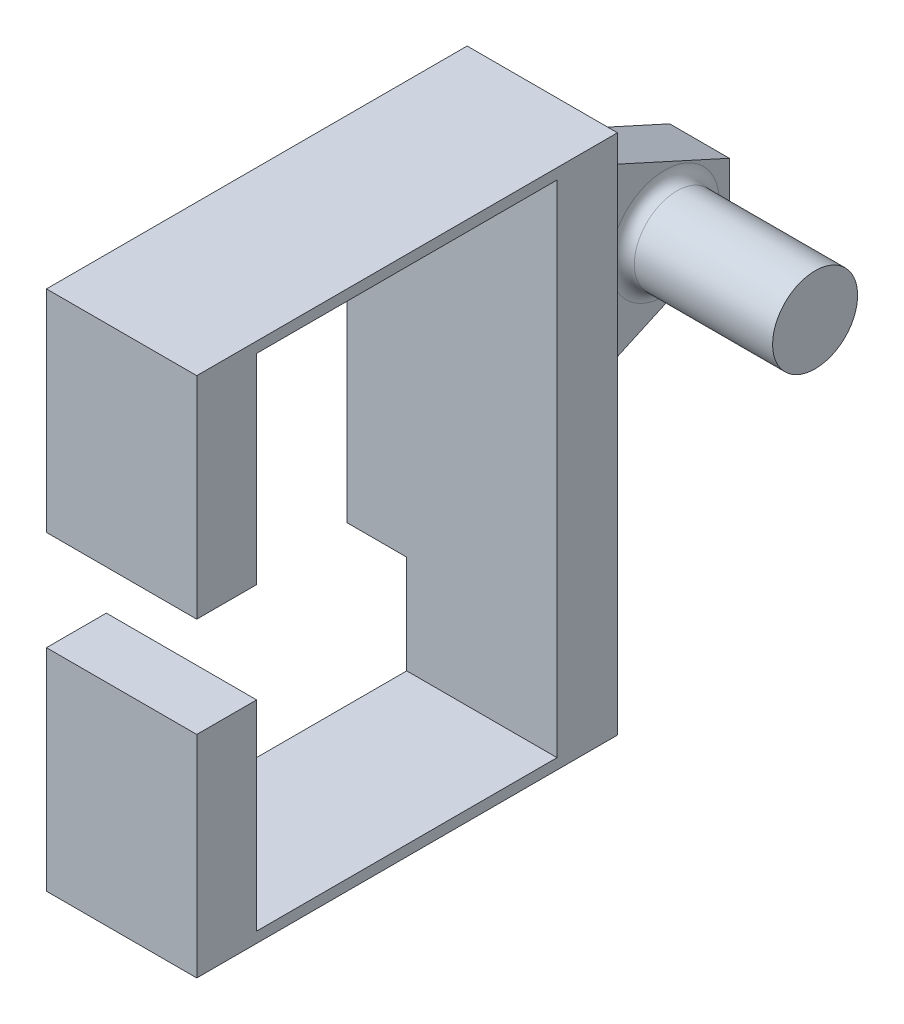
ISO-10303-21;
HEADER;
FILE_DESCRIPTION(('STEP AP214'),'2;1');
FILE_NAME('part.step','',(''),(''),'','','');
FILE_SCHEMA(('AUTOMOTIVE_DESIGN { 1 0 10303 214 1 1 1 1 }'));
ENDSEC;
DATA;
#1=APPLICATION_CONTEXT('core data for automotive mechanical design processes');
#2=APPLICATION_PROTOCOL_DEFINITION('international standard','automotive_design',2000,#1);
#3=PRODUCT_CONTEXT('',#1,'mechanical');
#4=PRODUCT('Part','Part','',(#3));
#5=PRODUCT_RELATED_PRODUCT_CATEGORY('part','',(#4));
#6=PRODUCT_DEFINITION_FORMATION('','',#4);
#7=PRODUCT_DEFINITION_CONTEXT('part definition',#1,'design');
#8=PRODUCT_DEFINITION('design','',#6,#7);
#9=PRODUCT_DEFINITION_SHAPE('','',#8);
#10=(LENGTH_UNIT() NAMED_UNIT(*) SI_UNIT(.MILLI.,.METRE.));
#11=(NAMED_UNIT(*) PLANE_ANGLE_UNIT() SI_UNIT($,.RADIAN.));
#12=(NAMED_UNIT(*) SI_UNIT($,.STERADIAN.) SOLID_ANGLE_UNIT());
#13=UNCERTAINTY_MEASURE_WITH_UNIT(LENGTH_MEASURE(1.E-05),#10,'distance_accuracy_value','');
#14=(GEOMETRIC_REPRESENTATION_CONTEXT(3) GLOBAL_UNCERTAINTY_ASSIGNED_CONTEXT((#13)) GLOBAL_UNIT_ASSIGNED_CONTEXT((#10,
#11,#12)) REPRESENTATION_CONTEXT('',''));
#15=CARTESIAN_POINT('',(0.,0.,0.));
#16=DIRECTION('',(0.,0.,1.));
#17=DIRECTION('',(1.,0.,0.));
#18=AXIS2_PLACEMENT_3D('',#15,#16,#17);
#19=CARTESIAN_POINT('',(-7.56143527171308,0.,0.));
#20=DIRECTION('',(-1.,0.,0.));
#21=DIRECTION('',(0.,0.,1.));
#22=AXIS2_PLACEMENT_3D('',#19,#20,#21);
#23=PLANE('',#22);
#24=DIRECTION('',(0.,-0.413743108028006,-0.910393673395925));
#25=VECTOR('',#24,1.);
#26=CARTESIAN_POINT('',(-7.56143527171308,38.4477314940831,-30.4424892876485));
#27=LINE('',#26,#25);
#28=CARTESIAN_POINT('',(-7.56143527171308,52.2828124069349,0.));
#29=VERTEX_POINT('',#28);
#30=CARTESIAN_POINT('',(-7.56143527171308,37.1779530700765,-33.2364892876485));
#31=VERTEX_POINT('',#30);
#32=EDGE_CURVE('E182',#29,#31,#27,.T.);
#33=ORIENTED_EDGE('',*,*,#32,.T.);
#34=DIRECTION('',(0.,-1.,0.));
#35=VECTOR('',#34,1.);
#36=CARTESIAN_POINT('',(-7.56143527171308,28.9399402497102,-33.2364892876485));
#37=LINE('',#36,#35);
#38=CARTESIAN_POINT('',(-7.56143527171308,28.9399402497102,-33.2364892876485));
#39=VERTEX_POINT('',#38);
#40=EDGE_CURVE('E58',#31,#39,#37,.T.);
#41=ORIENTED_EDGE('',*,*,#40,.T.);
#42=DIRECTION('',(0.,-0.413743108028007,0.910393673395925));
#43=VECTOR('',#42,1.);
#44=CARTESIAN_POINT('',(-7.56143527171308,27.6701618257036,-30.4424892876485));
#45=LINE('',#44,#43);
#46=CARTESIAN_POINT('',(-7.56143527171308,13.8350809128518,0.));
#47=VERTEX_POINT('',#46);
#48=EDGE_CURVE('E179',#39,#47,#45,.T.);
#49=ORIENTED_EDGE('',*,*,#48,.T.);
#50=DIRECTION('',(0.,0.,1.));
#51=VECTOR('',#50,1.);
#52=CARTESIAN_POINT('',(-7.56143527171308,13.8350809128518,0.));
#53=LINE('',#52,#51);
#54=CARTESIAN_POINT('',(-7.56143527171308,13.8350809128518,7.65751071235147));
#55=VERTEX_POINT('',#54);
#56=EDGE_CURVE('E188',#47,#55,#53,.T.);
#57=ORIENTED_EDGE('',*,*,#56,.T.);
#58=DIRECTION('',(0.,1.,0.));
#59=VECTOR('',#58,1.);
#60=CARTESIAN_POINT('',(-7.56143527171308,38.4477314940831,7.65751071235147));
#61=LINE('',#60,#59);
#62=CARTESIAN_POINT('',(-7.56143527171308,52.2828124069349,7.65751071235148));
#63=VERTEX_POINT('',#62);
#64=EDGE_CURVE('E200',#55,#63,#61,.T.);
#65=ORIENTED_EDGE('',*,*,#64,.T.);
#66=DIRECTION('',(0.,0.,-1.));
#67=VECTOR('',#66,1.);
#68=CARTESIAN_POINT('',(-7.56143527171308,52.2828124069349,0.));
#69=LINE('',#68,#67);
#70=EDGE_CURVE('E186',#63,#29,#69,.T.);
#71=ORIENTED_EDGE('',*,*,#70,.T.);
#72=EDGE_LOOP('',(#33,#41,#49,#57,#65,#71));
#73=FACE_BOUND('',#72,.T.);
#74=ADVANCED_FACE('F44',(#73),#23,.T.);
#75=CARTESIAN_POINT('',(0.,0.,0.));
#76=DIRECTION('',(-1.,0.,0.));
#77=DIRECTION('',(0.,0.,1.));
#78=AXIS2_PLACEMENT_3D('',#75,#76,#77);
#79=PLANE('',#78);
#80=CARTESIAN_POINT('',(0.,33.0589466598933,-25.0537044534588));
#81=DIRECTION('',(-1.,0.,0.));
#82=DIRECTION('',(0.,0.,1.));
#83=AXIS2_PLACEMENT_3D('',#80,#81,#82);
#84=CIRCLE('',#83,6.91278483418973);
#85=CARTESIAN_POINT('',(0.,33.0589466598933,-18.1409196192691));
#86=VERTEX_POINT('',#85);
#87=EDGE_CURVE('E11',#86,#86,#84,.T.);
#88=ORIENTED_EDGE('',*,*,#87,.T.);
#89=EDGE_LOOP('',(#88));
#90=FACE_BOUND('',#89,.T.);
#91=DIRECTION('',(0.,-1.,0.));
#92=VECTOR('',#91,1.);
#93=CARTESIAN_POINT('',(0.,28.9399402497102,-33.2364892876485));
#94=LINE('',#93,#92);
#95=CARTESIAN_POINT('',(0.,37.1779530700765,-33.2364892876485));
#96=VERTEX_POINT('',#95);
#97=CARTESIAN_POINT('',(0.,28.9399402497102,-33.2364892876485));
#98=VERTEX_POINT('',#97);
#99=EDGE_CURVE('E175',#96,#98,#94,.T.);
#100=ORIENTED_EDGE('',*,*,#99,.F.);
#101=DIRECTION('',(0.,-0.413743108028006,-0.910393673395925));
#102=VECTOR('',#101,1.);
#103=CARTESIAN_POINT('',(0.,38.4477314940831,-30.4424892876485));
#104=LINE('',#103,#102);
#105=CARTESIAN_POINT('',(0.,52.2828124069349,0.));
#106=VERTEX_POINT('',#105);
#107=EDGE_CURVE('E203',#106,#96,#104,.T.);
#108=ORIENTED_EDGE('',*,*,#107,.F.);
#109=DIRECTION('',(0.,1.,0.));
#110=VECTOR('',#109,1.);
#111=CARTESIAN_POINT('',(0.,0.,0.));
#112=LINE('',#111,#110);
#113=CARTESIAN_POINT('',(0.,13.8350809128518,0.));
#114=VERTEX_POINT('',#113);
#115=EDGE_CURVE('E232',#114,#106,#112,.T.);
#116=ORIENTED_EDGE('',*,*,#115,.F.);
#117=DIRECTION('',(0.,-0.413743108028006,0.910393673395925));
#118=VECTOR('',#117,1.);
#119=CARTESIAN_POINT('',(0.,27.6701618257036,-30.4424892876485));
#120=LINE('',#119,#118);
#121=EDGE_CURVE('E69',#98,#114,#120,.T.);
#122=ORIENTED_EDGE('',*,*,#121,.F.);
#123=EDGE_LOOP('',(#100,#108,#116,#122));
#124=FACE_BOUND('',#123,.T.);
#125=ADVANCED_FACE('F315',(#90,#124),#79,.F.);
#126=CARTESIAN_POINT('',(40.5341764917601,27.6701618257036,-30.4424892876485));
#127=DIRECTION('',(0.,-0.910393673395925,-0.413743108028006));
#128=DIRECTION('',(0.,0.413743108028006,-0.910393673395925));
#129=AXIS2_PLACEMENT_3D('',#126,#127,#128);
#130=PLANE('',#129);
#131=ORIENTED_EDGE('',*,*,#48,.F.);
#132=DIRECTION('',(1.,0.,0.));
#133=VECTOR('',#132,1.);
#134=CARTESIAN_POINT('',(-7.56143527171308,28.9399402497102,-33.2364892876485));
#135=LINE('',#134,#133);
#136=EDGE_CURVE('E169',#39,#98,#135,.T.);
#137=ORIENTED_EDGE('',*,*,#136,.T.);
#138=ORIENTED_EDGE('',*,*,#121,.T.);
#139=DIRECTION('',(-1.,0.,0.));
#140=VECTOR('',#139,1.);
#141=CARTESIAN_POINT('',(40.5341764917601,13.8350809128518,0.));
#142=LINE('',#141,#140);
#143=EDGE_CURVE('E190',#114,#47,#142,.T.);
#144=ORIENTED_EDGE('',*,*,#143,.T.);
#145=EDGE_LOOP('',(#131,#137,#138,#144));
#146=FACE_BOUND('',#145,.T.);
#147=ADVANCED_FACE('F184',(#146),#130,.T.);
#148=CARTESIAN_POINT('',(0.,0.,0.));
#149=DIRECTION('',(1.,0.,0.));
#150=DIRECTION('',(0.,0.,-1.));
#151=AXIS2_PLACEMENT_3D('',#148,#149,#150);
#152=PLANE('',#151);
#153=DIRECTION('',(0.,0.,-1.));
#154=VECTOR('',#153,1.);
#155=CARTESIAN_POINT('',(0.,52.2828124069349,0.));
#156=LINE('',#155,#154);
#157=CARTESIAN_POINT('',(0.,52.2828124069349,7.65751071235147));
#158=VERTEX_POINT('',#157);
#159=EDGE_CURVE('E404',#158,#106,#156,.T.);
#160=ORIENTED_EDGE('',*,*,#159,.F.);
#161=DIRECTION('',(0.,-1.,0.));
#162=VECTOR('',#161,1.);
#163=CARTESIAN_POINT('',(0.,1.35466665989335,7.65751071235147));
#164=LINE('',#163,#162);
#165=CARTESIAN_POINT('',(0.,64.7632266598933,7.65751071235147));
#166=VERTEX_POINT('',#165);
#167=EDGE_CURVE('E246',#166,#158,#164,.T.);
#168=ORIENTED_EDGE('',*,*,#167,.F.);
#169=DIRECTION('',(0.,0.,-1.));
#170=VECTOR('',#169,1.);
#171=CARTESIAN_POINT('',(0.,64.7632266598933,45.7321107123515));
#172=LINE('',#171,#170);
#173=CARTESIAN_POINT('',(0.,64.7632266598933,45.7321107123515));
#174=VERTEX_POINT('',#173);
#175=EDGE_CURVE('E243',#174,#166,#172,.T.);
#176=ORIENTED_EDGE('',*,*,#175,.F.);
#177=DIRECTION('',(0.,1.,0.));
#178=VECTOR('',#177,1.);
#179=CARTESIAN_POINT('',(0.,39.3835466598933,45.7321107123515));
#180=LINE('',#179,#178);
#181=CARTESIAN_POINT('',(0.,39.3835466598933,45.7321107123515));
#182=VERTEX_POINT('',#181);
#183=EDGE_CURVE('E241',#182,#174,#180,.T.);
#184=ORIENTED_EDGE('',*,*,#183,.F.);
#185=DIRECTION('',(0.,0.,-1.));
#186=VECTOR('',#185,1.);
#187=CARTESIAN_POINT('',(0.,39.3835466598933,53.3205661447543));
#188=LINE('',#187,#186);
#189=CARTESIAN_POINT('',(0.,39.3835466598933,53.3205661447543));
#190=VERTEX_POINT('',#189);
#191=EDGE_CURVE('E237',#190,#182,#188,.T.);
#192=ORIENTED_EDGE('',*,*,#191,.F.);
#193=DIRECTION('',(0.,-1.,0.));
#194=VECTOR('',#193,1.);
#195=CARTESIAN_POINT('',(0.,66.1178933197867,53.3205661447543));
#196=LINE('',#195,#194);
#197=CARTESIAN_POINT('',(0.,66.1178933197867,53.3205661447543));
#198=VERTEX_POINT('',#197);
#199=EDGE_CURVE('E240',#198,#190,#196,.T.);
#200=ORIENTED_EDGE('',*,*,#199,.F.);
#201=DIRECTION('',(0.,0.,1.));
#202=VECTOR('',#201,1.);
#203=CARTESIAN_POINT('',(0.,66.1178933197867,0.));
#204=LINE('',#203,#202);
#205=CARTESIAN_POINT('',(0.,66.1178933197867,0.));
#206=VERTEX_POINT('',#205);
#207=EDGE_CURVE('E234',#206,#198,#204,.T.);
#208=ORIENTED_EDGE('',*,*,#207,.F.);
#209=EDGE_CURVE('E202',#106,#206,#112,.T.);
#210=ORIENTED_EDGE('',*,*,#209,.F.);
#211=EDGE_LOOP('',(#160,#168,#176,#184,#192,#200,#208,#210));
#212=FACE_BOUND('',#211,.T.);
#213=ADVANCED_FACE('F327',(#212),#152,.F.);
#214=DIRECTION('',(0.,0.,1.));
#215=VECTOR('',#214,1.);
#216=CARTESIAN_POINT('',(0.,13.8350809128518,0.));
#217=LINE('',#216,#215);
#218=CARTESIAN_POINT('',(0.,13.8350809128518,7.65751071235147));
#219=VERTEX_POINT('',#218);
#220=EDGE_CURVE('E391',#114,#219,#217,.T.);
#221=ORIENTED_EDGE('',*,*,#220,.F.);
#222=CARTESIAN_POINT('',(0.,0.,0.));
#223=VERTEX_POINT('',#222);
#224=EDGE_CURVE('E233',#223,#114,#112,.T.);
#225=ORIENTED_EDGE('',*,*,#224,.F.);
#226=DIRECTION('',(0.,0.,-1.));
#227=VECTOR('',#226,1.);
#228=CARTESIAN_POINT('',(0.,0.,0.));
#229=LINE('',#228,#227);
#230=CARTESIAN_POINT('',(0.,0.,53.3205661447543));
#231=VERTEX_POINT('',#230);
#232=EDGE_CURVE('E206',#231,#223,#229,.T.);
#233=ORIENTED_EDGE('',*,*,#232,.F.);
#234=DIRECTION('',(0.,-1.,0.));
#235=VECTOR('',#234,1.);
#236=CARTESIAN_POINT('',(0.,0.,53.3205661447543));
#237=LINE('',#236,#235);
#238=CARTESIAN_POINT('',(0.,26.7343466598933,53.3205661447543));
#239=VERTEX_POINT('',#238);
#240=EDGE_CURVE('E253',#239,#231,#237,.T.);
#241=ORIENTED_EDGE('',*,*,#240,.F.);
#242=DIRECTION('',(0.,0.,1.));
#243=VECTOR('',#242,1.);
#244=CARTESIAN_POINT('',(0.,26.7343466598933,53.3205661447543));
#245=LINE('',#244,#243);
#246=CARTESIAN_POINT('',(0.,26.7343466598933,45.7321107123515));
#247=VERTEX_POINT('',#246);
#248=EDGE_CURVE('E254',#247,#239,#245,.T.);
#249=ORIENTED_EDGE('',*,*,#248,.F.);
#250=DIRECTION('',(0.,1.,0.));
#251=VECTOR('',#250,1.);
#252=CARTESIAN_POINT('',(0.,26.7343466598933,45.7321107123515));
#253=LINE('',#252,#251);
#254=CARTESIAN_POINT('',(0.,1.35466665989334,45.7321107123515));
#255=VERTEX_POINT('',#254);
#256=EDGE_CURVE('E252',#255,#247,#253,.T.);
#257=ORIENTED_EDGE('',*,*,#256,.F.);
#258=DIRECTION('',(0.,0.,1.));
#259=VECTOR('',#258,1.);
#260=CARTESIAN_POINT('',(0.,1.35466665989334,45.7321107123515));
#261=LINE('',#260,#259);
#262=CARTESIAN_POINT('',(0.,1.35466665989335,7.65751071235147));
#263=VERTEX_POINT('',#262);
#264=EDGE_CURVE('E248',#263,#255,#261,.T.);
#265=ORIENTED_EDGE('',*,*,#264,.F.);
#266=EDGE_CURVE('E244',#219,#263,#164,.T.);
#267=ORIENTED_EDGE('',*,*,#266,.F.);
#268=EDGE_LOOP('',(#221,#225,#233,#241,#249,#257,#265,#267));
#269=FACE_BOUND('',#268,.T.);
#270=ADVANCED_FACE('F330',(#269),#152,.F.);
#271=CARTESIAN_POINT('',(19.05,0.,0.));
#272=DIRECTION('',(0.,0.,1.));
#273=DIRECTION('',(1.,0.,0.));
#274=AXIS2_PLACEMENT_3D('',#271,#272,#273);
#275=PLANE('',#274);
#276=ORIENTED_EDGE('',*,*,#224,.T.);
#277=ORIENTED_EDGE('',*,*,#115,.T.);
#278=ORIENTED_EDGE('',*,*,#209,.T.);
#279=DIRECTION('',(-1.,0.,0.));
#280=VECTOR('',#279,1.);
#281=CARTESIAN_POINT('',(19.05,66.1178933197867,0.));
#282=LINE('',#281,#280);
#283=CARTESIAN_POINT('',(19.05,66.1178933197867,0.));
#284=VERTEX_POINT('',#283);
#285=EDGE_CURVE('E286',#284,#206,#282,.T.);
#286=ORIENTED_EDGE('',*,*,#285,.F.);
#287=DIRECTION('',(0.,1.,0.));
#288=VECTOR('',#287,1.);
#289=CARTESIAN_POINT('',(19.05,0.,0.));
#290=LINE('',#289,#288);
#291=CARTESIAN_POINT('',(19.05,0.,0.));
#292=VERTEX_POINT('',#291);
#293=EDGE_CURVE('E205',#292,#284,#290,.T.);
#294=ORIENTED_EDGE('',*,*,#293,.F.);
#295=DIRECTION('',(-1.,0.,0.));
#296=VECTOR('',#295,1.);
#297=CARTESIAN_POINT('',(19.05,0.,0.));
#298=LINE('',#297,#296);
#299=EDGE_CURVE('E229',#292,#223,#298,.T.);
#300=ORIENTED_EDGE('',*,*,#299,.T.);
#301=EDGE_LOOP('',(#276,#277,#278,#286,#294,#300));
#302=FACE_BOUND('',#301,.T.);
#303=ADVANCED_FACE('F373',(#302),#275,.F.);
#304=CARTESIAN_POINT('',(19.05,66.1178933197867,0.));
#305=DIRECTION('',(0.,-1.,0.));
#306=DIRECTION('',(0.,0.,-1.));
#307=AXIS2_PLACEMENT_3D('',#304,#305,#306);
#308=PLANE('',#307);
#309=ORIENTED_EDGE('',*,*,#207,.T.);
#310=DIRECTION('',(-1.,0.,0.));
#311=VECTOR('',#310,1.);
#312=CARTESIAN_POINT('',(19.05,66.1178933197867,53.3205661447543));
#313=LINE('',#312,#311);
#314=CARTESIAN_POINT('',(19.05,66.1178933197867,53.3205661447543));
#315=VERTEX_POINT('',#314);
#316=EDGE_CURVE('E289',#315,#198,#313,.T.);
#317=ORIENTED_EDGE('',*,*,#316,.F.);
#318=DIRECTION('',(0.,0.,1.));
#319=VECTOR('',#318,1.);
#320=CARTESIAN_POINT('',(19.05,66.1178933197867,0.));
#321=LINE('',#320,#319);
#322=EDGE_CURVE('E210',#284,#315,#321,.T.);
#323=ORIENTED_EDGE('',*,*,#322,.F.);
#324=ORIENTED_EDGE('',*,*,#285,.T.);
#325=EDGE_LOOP('',(#309,#317,#323,#324));
#326=FACE_BOUND('',#325,.T.);
#327=ADVANCED_FACE('F369',(#326),#308,.F.);
#328=CARTESIAN_POINT('',(19.05,66.1178933197867,53.3205661447543));
#329=DIRECTION('',(0.,0.,-1.));
#330=DIRECTION('',(-1.,0.,0.));
#331=AXIS2_PLACEMENT_3D('',#328,#329,#330);
#332=PLANE('',#331);
#333=ORIENTED_EDGE('',*,*,#199,.T.);
#334=DIRECTION('',(-1.,0.,0.));
#335=VECTOR('',#334,1.);
#336=CARTESIAN_POINT('',(19.05,39.3835466598933,53.3205661447543));
#337=LINE('',#336,#335);
#338=CARTESIAN_POINT('',(19.05,39.3835466598933,53.3205661447543));
#339=VERTEX_POINT('',#338);
#340=EDGE_CURVE('E283',#339,#190,#337,.T.);
#341=ORIENTED_EDGE('',*,*,#340,.F.);
#342=DIRECTION('',(0.,-1.,0.));
#343=VECTOR('',#342,1.);
#344=CARTESIAN_POINT('',(19.05,66.1178933197867,53.3205661447543));
#345=LINE('',#344,#343);
#346=EDGE_CURVE('E208',#315,#339,#345,.T.);
#347=ORIENTED_EDGE('',*,*,#346,.F.);
#348=ORIENTED_EDGE('',*,*,#316,.T.);
#349=EDGE_LOOP('',(#333,#341,#347,#348));
#350=FACE_BOUND('',#349,.T.);
#351=ADVANCED_FACE('F366',(#350),#332,.F.);
#352=CARTESIAN_POINT('',(19.05,39.3835466598933,53.3205661447543));
#353=DIRECTION('',(0.,1.,0.));
#354=DIRECTION('',(0.,0.,1.));
#355=AXIS2_PLACEMENT_3D('',#352,#353,#354);
#356=PLANE('',#355);
#357=ORIENTED_EDGE('',*,*,#191,.T.);
#358=DIRECTION('',(-1.,0.,0.));
#359=VECTOR('',#358,1.);
#360=CARTESIAN_POINT('',(19.05,39.3835466598933,45.7321107123515));
#361=LINE('',#360,#359);
#362=CARTESIAN_POINT('',(19.05,39.3835466598933,45.7321107123515));
#363=VERTEX_POINT('',#362);
#364=EDGE_CURVE('E281',#363,#182,#361,.T.);
#365=ORIENTED_EDGE('',*,*,#364,.F.);
#366=DIRECTION('',(0.,0.,-1.));
#367=VECTOR('',#366,1.);
#368=CARTESIAN_POINT('',(19.05,39.3835466598933,53.3205661447543));
#369=LINE('',#368,#367);
#370=EDGE_CURVE('E215',#339,#363,#369,.T.);
#371=ORIENTED_EDGE('',*,*,#370,.F.);
#372=ORIENTED_EDGE('',*,*,#340,.T.);
#373=EDGE_LOOP('',(#357,#365,#371,#372));
#374=FACE_BOUND('',#373,.T.);
#375=ADVANCED_FACE('F365',(#374),#356,.F.);
#376=CARTESIAN_POINT('',(19.05,39.3835466598933,45.7321107123515));
#377=DIRECTION('',(0.,0.,1.));
#378=DIRECTION('',(1.,0.,0.));
#379=AXIS2_PLACEMENT_3D('',#376,#377,#378);
#380=PLANE('',#379);
#381=ORIENTED_EDGE('',*,*,#183,.T.);
#382=DIRECTION('',(-1.,0.,0.));
#383=VECTOR('',#382,1.);
#384=CARTESIAN_POINT('',(19.05,64.7632266598933,45.7321107123515));
#385=LINE('',#384,#383);
#386=CARTESIAN_POINT('',(19.05,64.7632266598933,45.7321107123515));
#387=VERTEX_POINT('',#386);
#388=EDGE_CURVE('E279',#387,#174,#385,.T.);
#389=ORIENTED_EDGE('',*,*,#388,.F.);
#390=DIRECTION('',(0.,1.,0.));
#391=VECTOR('',#390,1.);
#392=CARTESIAN_POINT('',(19.05,39.3835466598933,45.7321107123515));
#393=LINE('',#392,#391);
#394=EDGE_CURVE('E211',#363,#387,#393,.T.);
#395=ORIENTED_EDGE('',*,*,#394,.F.);
#396=ORIENTED_EDGE('',*,*,#364,.T.);
#397=EDGE_LOOP('',(#381,#389,#395,#396));
#398=FACE_BOUND('',#397,.T.);
#399=ADVANCED_FACE('F356',(#398),#380,.F.);
#400=CARTESIAN_POINT('',(19.05,64.7632266598933,45.7321107123515));
#401=DIRECTION('',(0.,1.,0.));
#402=DIRECTION('',(0.,0.,1.));
#403=AXIS2_PLACEMENT_3D('',#400,#401,#402);
#404=PLANE('',#403);
#405=ORIENTED_EDGE('',*,*,#175,.T.);
#406=DIRECTION('',(-1.,0.,0.));
#407=VECTOR('',#406,1.);
#408=CARTESIAN_POINT('',(19.05,64.7632266598933,7.65751071235147));
#409=LINE('',#408,#407);
#410=CARTESIAN_POINT('',(19.05,64.7632266598933,7.65751071235147));
#411=VERTEX_POINT('',#410);
#412=EDGE_CURVE('E273',#411,#166,#409,.T.);
#413=ORIENTED_EDGE('',*,*,#412,.F.);
#414=DIRECTION('',(0.,0.,-1.));
#415=VECTOR('',#414,1.);
#416=CARTESIAN_POINT('',(19.05,64.7632266598933,45.7321107123515));
#417=LINE('',#416,#415);
#418=EDGE_CURVE('E216',#387,#411,#417,.T.);
#419=ORIENTED_EDGE('',*,*,#418,.F.);
#420=ORIENTED_EDGE('',*,*,#388,.T.);
#421=EDGE_LOOP('',(#405,#413,#419,#420));
#422=FACE_BOUND('',#421,.T.);
#423=ADVANCED_FACE('F355',(#422),#404,.F.);
#424=CARTESIAN_POINT('',(19.05,1.35466665989335,7.65751071235147));
#425=DIRECTION('',(0.,0.,-1.));
#426=DIRECTION('',(-1.,0.,0.));
#427=AXIS2_PLACEMENT_3D('',#424,#425,#426);
#428=PLANE('',#427);
#429=ORIENTED_EDGE('',*,*,#167,.T.);
#430=DIRECTION('',(-1.,0.,0.));
#431=VECTOR('',#430,1.);
#432=CARTESIAN_POINT('',(40.5341764917601,52.2828124069349,7.65751071235148));
#433=LINE('',#432,#431);
#434=EDGE_CURVE('E395',#158,#63,#433,.T.);
#435=ORIENTED_EDGE('',*,*,#434,.T.);
#436=ORIENTED_EDGE('',*,*,#64,.F.);
#437=DIRECTION('',(-1.,0.,0.));
#438=VECTOR('',#437,1.);
#439=CARTESIAN_POINT('',(40.5341764917601,13.8350809128518,7.65751071235147));
#440=LINE('',#439,#438);
#441=EDGE_CURVE('E172',#219,#55,#440,.T.);
#442=ORIENTED_EDGE('',*,*,#441,.F.);
#443=ORIENTED_EDGE('',*,*,#266,.T.);
#444=DIRECTION('',(-1.,0.,0.));
#445=VECTOR('',#444,1.);
#446=CARTESIAN_POINT('',(19.05,1.35466665989335,7.65751071235147));
#447=LINE('',#446,#445);
#448=CARTESIAN_POINT('',(19.05,1.35466665989335,7.65751071235147));
#449=VERTEX_POINT('',#448);
#450=EDGE_CURVE('E275',#449,#263,#447,.T.);
#451=ORIENTED_EDGE('',*,*,#450,.F.);
#452=DIRECTION('',(0.,-1.,0.));
#453=VECTOR('',#452,1.);
#454=CARTESIAN_POINT('',(19.05,1.35466665989335,7.65751071235147));
#455=LINE('',#454,#453);
#456=EDGE_CURVE('E219',#411,#449,#455,.T.);
#457=ORIENTED_EDGE('',*,*,#456,.F.);
#458=ORIENTED_EDGE('',*,*,#412,.T.);
#459=EDGE_LOOP('',(#429,#435,#436,#442,#443,#451,#457,#458));
#460=FACE_BOUND('',#459,.T.);
#461=ADVANCED_FACE('F350',(#460),#428,.F.);
#462=CARTESIAN_POINT('',(19.05,1.35466665989334,45.7321107123515));
#463=DIRECTION('',(0.,-1.,0.));
#464=DIRECTION('',(0.,0.,-1.));
#465=AXIS2_PLACEMENT_3D('',#462,#463,#464);
#466=PLANE('',#465);
#467=ORIENTED_EDGE('',*,*,#264,.T.);
#468=DIRECTION('',(-1.,0.,0.));
#469=VECTOR('',#468,1.);
#470=CARTESIAN_POINT('',(19.05,1.35466665989334,45.7321107123515));
#471=LINE('',#470,#469);
#472=CARTESIAN_POINT('',(19.05,1.35466665989334,45.7321107123515));
#473=VERTEX_POINT('',#472);
#474=EDGE_CURVE('E270',#473,#255,#471,.T.);
#475=ORIENTED_EDGE('',*,*,#474,.F.);
#476=DIRECTION('',(0.,0.,1.));
#477=VECTOR('',#476,1.);
#478=CARTESIAN_POINT('',(19.05,1.35466665989334,45.7321107123515));
#479=LINE('',#478,#477);
#480=EDGE_CURVE('E220',#449,#473,#479,.T.);
#481=ORIENTED_EDGE('',*,*,#480,.F.);
#482=ORIENTED_EDGE('',*,*,#450,.T.);
#483=EDGE_LOOP('',(#467,#475,#481,#482));
#484=FACE_BOUND('',#483,.T.);
#485=ADVANCED_FACE('F346',(#484),#466,.F.);
#486=CARTESIAN_POINT('',(19.05,26.7343466598933,45.7321107123515));
#487=DIRECTION('',(0.,0.,1.));
#488=DIRECTION('',(1.,0.,0.));
#489=AXIS2_PLACEMENT_3D('',#486,#487,#488);
#490=PLANE('',#489);
#491=ORIENTED_EDGE('',*,*,#256,.T.);
#492=DIRECTION('',(-1.,0.,0.));
#493=VECTOR('',#492,1.);
#494=CARTESIAN_POINT('',(19.05,26.7343466598933,45.7321107123515));
#495=LINE('',#494,#493);
#496=CARTESIAN_POINT('',(19.05,26.7343466598933,45.7321107123515));
#497=VERTEX_POINT('',#496);
#498=EDGE_CURVE('E268',#497,#247,#495,.T.);
#499=ORIENTED_EDGE('',*,*,#498,.F.);
#500=DIRECTION('',(0.,1.,0.));
#501=VECTOR('',#500,1.);
#502=CARTESIAN_POINT('',(19.05,26.7343466598933,45.7321107123515));
#503=LINE('',#502,#501);
#504=EDGE_CURVE('E224',#473,#497,#503,.T.);
#505=ORIENTED_EDGE('',*,*,#504,.F.);
#506=ORIENTED_EDGE('',*,*,#474,.T.);
#507=EDGE_LOOP('',(#491,#499,#505,#506));
#508=FACE_BOUND('',#507,.T.);
#509=ADVANCED_FACE('F345',(#508),#490,.F.);
#510=CARTESIAN_POINT('',(19.05,26.7343466598933,53.3205661447543));
#511=DIRECTION('',(0.,-1.,0.));
#512=DIRECTION('',(0.,0.,-1.));
#513=AXIS2_PLACEMENT_3D('',#510,#511,#512);
#514=PLANE('',#513);
#515=ORIENTED_EDGE('',*,*,#248,.T.);
#516=DIRECTION('',(-1.,0.,0.));
#517=VECTOR('',#516,1.);
#518=CARTESIAN_POINT('',(19.05,26.7343466598933,53.3205661447543));
#519=LINE('',#518,#517);
#520=CARTESIAN_POINT('',(19.05,26.7343466598933,53.3205661447543));
#521=VERTEX_POINT('',#520);
#522=EDGE_CURVE('E264',#521,#239,#519,.T.);
#523=ORIENTED_EDGE('',*,*,#522,.F.);
#524=DIRECTION('',(0.,0.,1.));
#525=VECTOR('',#524,1.);
#526=CARTESIAN_POINT('',(19.05,26.7343466598933,53.3205661447543));
#527=LINE('',#526,#525);
#528=EDGE_CURVE('E225',#497,#521,#527,.T.);
#529=ORIENTED_EDGE('',*,*,#528,.F.);
#530=ORIENTED_EDGE('',*,*,#498,.T.);
#531=EDGE_LOOP('',(#515,#523,#529,#530));
#532=FACE_BOUND('',#531,.T.);
#533=ADVANCED_FACE('F336',(#532),#514,.F.);
#534=CARTESIAN_POINT('',(19.05,0.,53.3205661447543));
#535=DIRECTION('',(0.,0.,-1.));
#536=DIRECTION('',(-1.,0.,0.));
#537=AXIS2_PLACEMENT_3D('',#534,#535,#536);
#538=PLANE('',#537);
#539=ORIENTED_EDGE('',*,*,#240,.T.);
#540=DIRECTION('',(-1.,0.,0.));
#541=VECTOR('',#540,1.);
#542=CARTESIAN_POINT('',(19.05,0.,53.3205661447543));
#543=LINE('',#542,#541);
#544=CARTESIAN_POINT('',(19.05,0.,53.3205661447543));
#545=VERTEX_POINT('',#544);
#546=EDGE_CURVE('E258',#545,#231,#543,.T.);
#547=ORIENTED_EDGE('',*,*,#546,.F.);
#548=DIRECTION('',(0.,-1.,0.));
#549=VECTOR('',#548,1.);
#550=CARTESIAN_POINT('',(19.05,0.,53.3205661447543));
#551=LINE('',#550,#549);
#552=EDGE_CURVE('E228',#521,#545,#551,.T.);
#553=ORIENTED_EDGE('',*,*,#552,.F.);
#554=ORIENTED_EDGE('',*,*,#522,.T.);
#555=EDGE_LOOP('',(#539,#547,#553,#554));
#556=FACE_BOUND('',#555,.T.);
#557=ADVANCED_FACE('F335',(#556),#538,.F.);
#558=CARTESIAN_POINT('',(19.05,0.,0.));
#559=DIRECTION('',(0.,1.,0.));
#560=DIRECTION('',(0.,0.,1.));
#561=AXIS2_PLACEMENT_3D('',#558,#559,#560);
#562=PLANE('',#561);
#563=ORIENTED_EDGE('',*,*,#232,.T.);
#564=ORIENTED_EDGE('',*,*,#299,.F.);
#565=DIRECTION('',(0.,0.,-1.));
#566=VECTOR('',#565,1.);
#567=CARTESIAN_POINT('',(19.05,0.,0.));
#568=LINE('',#567,#566);
#569=EDGE_CURVE('E226',#545,#292,#568,.T.);
#570=ORIENTED_EDGE('',*,*,#569,.F.);
#571=ORIENTED_EDGE('',*,*,#546,.T.);
#572=EDGE_LOOP('',(#563,#564,#570,#571));
#573=FACE_BOUND('',#572,.T.);
#574=ADVANCED_FACE('F323',(#573),#562,.F.);
#575=CARTESIAN_POINT('',(19.05,0.,0.));
#576=DIRECTION('',(1.,0.,0.));
#577=DIRECTION('',(0.,0.,-1.));
#578=AXIS2_PLACEMENT_3D('',#575,#576,#577);
#579=PLANE('',#578);
#580=ORIENTED_EDGE('',*,*,#293,.T.);
#581=ORIENTED_EDGE('',*,*,#322,.T.);
#582=ORIENTED_EDGE('',*,*,#346,.T.);
#583=ORIENTED_EDGE('',*,*,#370,.T.);
#584=ORIENTED_EDGE('',*,*,#394,.T.);
#585=ORIENTED_EDGE('',*,*,#418,.T.);
#586=ORIENTED_EDGE('',*,*,#456,.T.);
#587=ORIENTED_EDGE('',*,*,#480,.T.);
#588=ORIENTED_EDGE('',*,*,#504,.T.);
#589=ORIENTED_EDGE('',*,*,#528,.T.);
#590=ORIENTED_EDGE('',*,*,#552,.T.);
#591=ORIENTED_EDGE('',*,*,#569,.T.);
#592=EDGE_LOOP('',(#580,#581,#582,#583,#584,#585,#586,#587,#588,#589,#590,#591));
#593=FACE_BOUND('',#592,.T.);
#594=ADVANCED_FACE('F325',(#593),#579,.T.);
#595=CARTESIAN_POINT('',(19.05,33.0589466598933,-25.0537044534588));
#596=DIRECTION('',(-1.,0.,0.));
#597=DIRECTION('',(0.,0.,1.));
#598=AXIS2_PLACEMENT_3D('',#595,#596,#597);
#599=CYLINDRICAL_SURFACE('',#598,5.38878483418973);
#600=CARTESIAN_POINT('',(1.524,33.0589466598933,-25.0537044534588));
#601=DIRECTION('',(-1.,0.,0.));
#602=DIRECTION('',(0.,0.,1.));
#603=AXIS2_PLACEMENT_3D('',#600,#601,#602);
#604=CIRCLE('',#603,5.38878483418973);
#605=CARTESIAN_POINT('',(1.524,33.0589466598933,-19.6649196192691));
#606=VERTEX_POINT('',#605);
#607=EDGE_CURVE('E52',#606,#606,#604,.F.);
#608=CARTESIAN_POINT('',(19.05,33.0589466598933,-25.0537044534588));
#609=DIRECTION('',(1.,0.,0.));
#610=DIRECTION('',(0.,0.,-1.));
#611=AXIS2_PLACEMENT_3D('',#608,#609,#610);
#612=CIRCLE('',#611,5.38878483418973);
#613=CARTESIAN_POINT('',(19.05,33.0589466598933,-19.6649196192691));
#614=VERTEX_POINT('',#613);
#615=EDGE_CURVE('E197',#614,#614,#612,.T.);
#616=CARTESIAN_POINT('',(1.524,33.0589466598933,-19.6649196192691));
#617=CARTESIAN_POINT('',(1.70656250000001,33.0589466598933,-19.6649196192691));
#618=CARTESIAN_POINT('',(1.88912500000001,33.0589466598933,-19.6649196192691));
#619=CARTESIAN_POINT('',(2.25425,33.0589466598933,-19.6649196192691));
#620=CARTESIAN_POINT('',(2.4368125,33.0589466598933,-19.6649196192691));
#621=CARTESIAN_POINT('',(2.8019375,33.0589466598933,-19.6649196192691));
#622=CARTESIAN_POINT('',(2.9845,33.0589466598933,-19.6649196192691));
#623=CARTESIAN_POINT('',(3.349625,33.0589466598933,-19.6649196192691));
#624=CARTESIAN_POINT('',(3.5321875,33.0589466598933,-19.6649196192691));
#625=CARTESIAN_POINT('',(3.8973125,33.0589466598933,-19.6649196192691));
#626=CARTESIAN_POINT('',(4.079875,33.0589466598933,-19.6649196192691));
#627=CARTESIAN_POINT('',(4.445,33.0589466598933,-19.6649196192691));
#628=CARTESIAN_POINT('',(4.6275625,33.0589466598933,-19.6649196192691));
#629=CARTESIAN_POINT('',(4.9926875,33.0589466598933,-19.6649196192691));
#630=CARTESIAN_POINT('',(5.17525,33.0589466598933,-19.6649196192691));
#631=CARTESIAN_POINT('',(5.540375,33.0589466598933,-19.6649196192691));
#632=CARTESIAN_POINT('',(5.7229375,33.0589466598933,-19.6649196192691));
#633=CARTESIAN_POINT('',(6.0880625,33.0589466598933,-19.6649196192691));
#634=CARTESIAN_POINT('',(6.270625,33.0589466598933,-19.6649196192691));
#635=CARTESIAN_POINT('',(6.63575,33.0589466598933,-19.6649196192691));
#636=CARTESIAN_POINT('',(6.8183125,33.0589466598933,-19.6649196192691));
#637=CARTESIAN_POINT('',(7.1834375,33.0589466598933,-19.6649196192691));
#638=CARTESIAN_POINT('',(7.366,33.0589466598933,-19.6649196192691));
#639=CARTESIAN_POINT('',(7.731125,33.0589466598933,-19.6649196192691));
#640=CARTESIAN_POINT('',(7.9136875,33.0589466598933,-19.6649196192691));
#641=CARTESIAN_POINT('',(8.2788125,33.0589466598933,-19.6649196192691));
#642=CARTESIAN_POINT('',(8.461375,33.0589466598933,-19.6649196192691));
#643=CARTESIAN_POINT('',(8.8265,33.0589466598933,-19.6649196192691));
#644=CARTESIAN_POINT('',(9.0090625,33.0589466598933,-19.6649196192691));
#645=CARTESIAN_POINT('',(9.3741875,33.0589466598933,-19.6649196192691));
#646=CARTESIAN_POINT('',(9.55675,33.0589466598933,-19.6649196192691));
#647=CARTESIAN_POINT('',(9.921875,33.0589466598933,-19.6649196192691));
#648=CARTESIAN_POINT('',(10.1044375,33.0589466598933,-19.6649196192691));
#649=CARTESIAN_POINT('',(10.4695625,33.0589466598933,-19.6649196192691));
#650=CARTESIAN_POINT('',(10.652125,33.0589466598933,-19.6649196192691));
#651=CARTESIAN_POINT('',(11.01725,33.0589466598933,-19.6649196192691));
#652=CARTESIAN_POINT('',(11.1998125,33.0589466598933,-19.6649196192691));
#653=CARTESIAN_POINT('',(11.5649375,33.0589466598933,-19.6649196192691));
#654=CARTESIAN_POINT('',(11.7475,33.0589466598933,-19.6649196192691));
#655=CARTESIAN_POINT('',(12.112625,33.0589466598933,-19.6649196192691));
#656=CARTESIAN_POINT('',(12.2951875,33.0589466598933,-19.6649196192691));
#657=CARTESIAN_POINT('',(12.6603125,33.0589466598933,-19.6649196192691));
#658=CARTESIAN_POINT('',(12.842875,33.0589466598933,-19.6649196192691));
#659=CARTESIAN_POINT('',(13.208,33.0589466598933,-19.6649196192691));
#660=CARTESIAN_POINT('',(13.3905625,33.0589466598933,-19.6649196192691));
#661=CARTESIAN_POINT('',(13.7556875,33.0589466598933,-19.6649196192691));
#662=CARTESIAN_POINT('',(13.93825,33.0589466598933,-19.6649196192691));
#663=CARTESIAN_POINT('',(14.303375,33.0589466598933,-19.6649196192691));
#664=CARTESIAN_POINT('',(14.4859375,33.0589466598933,-19.6649196192691));
#665=CARTESIAN_POINT('',(14.8510625,33.0589466598933,-19.6649196192691));
#666=CARTESIAN_POINT('',(15.033625,33.0589466598933,-19.6649196192691));
#667=CARTESIAN_POINT('',(15.39875,33.0589466598933,-19.6649196192691));
#668=CARTESIAN_POINT('',(15.5813125,33.0589466598933,-19.6649196192691));
#669=CARTESIAN_POINT('',(15.9464375,33.0589466598933,-19.6649196192691));
#670=CARTESIAN_POINT('',(16.129,33.0589466598933,-19.6649196192691));
#671=CARTESIAN_POINT('',(16.494125,33.0589466598933,-19.6649196192691));
#672=CARTESIAN_POINT('',(16.6766875,33.0589466598933,-19.6649196192691));
#673=CARTESIAN_POINT('',(17.0418125,33.0589466598933,-19.6649196192691));
#674=CARTESIAN_POINT('',(17.224375,33.0589466598933,-19.6649196192691));
#675=CARTESIAN_POINT('',(17.5895,33.0589466598933,-19.6649196192691));
#676=CARTESIAN_POINT('',(17.7720625,33.0589466598933,-19.6649196192691));
#677=CARTESIAN_POINT('',(18.1371875,33.0589466598933,-19.6649196192691));
#678=CARTESIAN_POINT('',(18.31975,33.0589466598933,-19.6649196192691));
#679=CARTESIAN_POINT('',(18.684875,33.0589466598933,-19.6649196192691));
#680=CARTESIAN_POINT('',(18.8674375,33.0589466598933,-19.6649196192691));
#681=CARTESIAN_POINT('',(19.05,33.0589466598933,-19.6649196192691));
#682=B_SPLINE_CURVE_WITH_KNOTS('',3,(#616,#617,#618,#619,#620,#621,#622,#623,#624,#625,#626,
#627,#628,#629,#630,#631,#632,#633,#634,#635,#636,#637,#638,#639,#640,#641,#642,#643,#644,#645,
#646,#647,#648,#649,#650,#651,#652,#653,#654,#655,#656,#657,#658,#659,#660,#661,#662,#663,#664,
#665,#666,#667,#668,#669,#670,#671,#672,#673,#674,#675,#676,#677,#678,#679,#680,#681),
.UNSPECIFIED.,.F.,.F.,(4,2,2,2,2,2,2,2,2,2,2,2,2,2,2,2,2,2,2,2,2,2,2,2,2,2,2,2,2,2,2,2,4),(0.,
0.547687500000001,1.095375,1.6430625,2.19075,2.7384375,3.286125,3.8338125,4.3815,4.9291875,
5.476875,6.0245625,6.57225,7.1199375,7.667625,8.2153125,8.763,9.3106875,9.858375,10.4060625,
10.95375,11.5014375,12.049125,12.5968125,13.1445,13.6921875,14.239875,14.7875625,15.33525,
15.8829375,16.430625,16.9783125,17.526),.UNSPECIFIED.);
#683=EDGE_CURVE('BSEAM294',#606,#614,#682,.T.);
#684=ORIENTED_EDGE('',*,*,#607,.T.);
#685=ORIENTED_EDGE('',*,*,#615,.F.);
#686=ORIENTED_EDGE('',*,*,#683,.T.);
#687=ORIENTED_EDGE('',*,*,#683,.F.);
#688=EDGE_LOOP('',(#684,#686,#685,#687));
#689=FACE_BOUND('',#688,.T.);
#690=ADVANCED_FACE('F294',(#689),#599,.T.);
#691=CARTESIAN_POINT('',(19.05,33.0589466598933,-25.0537044534588));
#692=DIRECTION('',(1.,0.,0.));
#693=DIRECTION('',(0.,0.,-1.));
#694=AXIS2_PLACEMENT_3D('',#691,#692,#693);
#695=PLANE('',#694);
#696=ORIENTED_EDGE('',*,*,#615,.T.);
#697=EDGE_LOOP('',(#696));
#698=FACE_BOUND('',#697,.T.);
#699=ADVANCED_FACE('F448',(#698),#695,.T.);
#700=CARTESIAN_POINT('',(40.5341764917601,13.8350809128518,0.));
#701=DIRECTION('',(0.,-1.,0.));
#702=DIRECTION('',(0.,0.,-1.));
#703=AXIS2_PLACEMENT_3D('',#700,#701,#702);
#704=PLANE('',#703);
#705=ORIENTED_EDGE('',*,*,#143,.F.);
#706=ORIENTED_EDGE('',*,*,#220,.T.);
#707=ORIENTED_EDGE('',*,*,#441,.T.);
#708=ORIENTED_EDGE('',*,*,#56,.F.);
#709=EDGE_LOOP('',(#705,#706,#707,#708));
#710=FACE_BOUND('',#709,.T.);
#711=ADVANCED_FACE('F386',(#710),#704,.T.);
#712=CARTESIAN_POINT('',(40.5341764917601,52.2828124069349,0.));
#713=DIRECTION('',(0.,1.,0.));
#714=DIRECTION('',(0.,0.,1.));
#715=AXIS2_PLACEMENT_3D('',#712,#713,#714);
#716=PLANE('',#715);
#717=ORIENTED_EDGE('',*,*,#434,.F.);
#718=ORIENTED_EDGE('',*,*,#159,.T.);
#719=DIRECTION('',(-1.,0.,0.));
#720=VECTOR('',#719,1.);
#721=CARTESIAN_POINT('',(40.5341764917601,52.2828124069349,0.));
#722=LINE('',#721,#720);
#723=EDGE_CURVE('E407',#106,#29,#722,.T.);
#724=ORIENTED_EDGE('',*,*,#723,.T.);
#725=ORIENTED_EDGE('',*,*,#70,.F.);
#726=EDGE_LOOP('',(#717,#718,#724,#725));
#727=FACE_BOUND('',#726,.T.);
#728=ADVANCED_FACE('F308',(#727),#716,.T.);
#729=CARTESIAN_POINT('',(40.5341764917601,38.4477314940831,-30.4424892876485));
#730=DIRECTION('',(0.,0.910393673395925,-0.413743108028006));
#731=DIRECTION('',(0.,0.413743108028006,0.910393673395925));
#732=AXIS2_PLACEMENT_3D('',#729,#730,#731);
#733=PLANE('',#732);
#734=DIRECTION('',(1.,0.,0.));
#735=VECTOR('',#734,1.);
#736=CARTESIAN_POINT('',(-7.56143527171308,37.1779530700765,-33.2364892876485));
#737=LINE('',#736,#735);
#738=EDGE_CURVE('E174',#31,#96,#737,.T.);
#739=ORIENTED_EDGE('',*,*,#738,.F.);
#740=ORIENTED_EDGE('',*,*,#32,.F.);
#741=ORIENTED_EDGE('',*,*,#723,.F.);
#742=ORIENTED_EDGE('',*,*,#107,.T.);
#743=EDGE_LOOP('',(#739,#740,#741,#742));
#744=FACE_BOUND('',#743,.T.);
#745=ADVANCED_FACE('F299',(#744),#733,.T.);
#746=CARTESIAN_POINT('',(1.524,33.0589466598933,-25.0537044534588));
#747=DIRECTION('',(-1.,0.,0.));
#748=DIRECTION('',(0.,0.,1.));
#749=AXIS2_PLACEMENT_3D('',#746,#747,#748);
#750=TOROIDAL_SURFACE('',#749,6.91278483418973,1.524);
#751=ORIENTED_EDGE('',*,*,#87,.F.);
#752=EDGE_LOOP('',(#751));
#753=FACE_BOUND('',#752,.T.);
#754=ORIENTED_EDGE('',*,*,#607,.F.);
#755=EDGE_LOOP('',(#754));
#756=FACE_BOUND('',#755,.T.);
#757=ADVANCED_FACE('F50',(#753,#756),#750,.F.);
#758=CARTESIAN_POINT('',(-7.56143527171308,28.9399402497102,-33.2364892876485));
#759=DIRECTION('',(0.,0.,1.));
#760=DIRECTION('',(1.,0.,0.));
#761=AXIS2_PLACEMENT_3D('',#758,#759,#760);
#762=PLANE('',#761);
#763=ORIENTED_EDGE('',*,*,#99,.T.);
#764=ORIENTED_EDGE('',*,*,#136,.F.);
#765=ORIENTED_EDGE('',*,*,#40,.F.);
#766=ORIENTED_EDGE('',*,*,#738,.T.);
#767=EDGE_LOOP('',(#763,#764,#765,#766));
#768=FACE_BOUND('',#767,.T.);
#769=ADVANCED_FACE('F167',(#768),#762,.F.);
#770=CLOSED_SHELL('',(#74,#125,#147,#213,#270,#303,#327,#351,#375,#399,#423,#461,#485,#509,#533,
#557,#574,#594,#690,#699,#711,#728,#745,#757,#769));
#771=MANIFOLD_SOLID_BREP('B2',#770);
#772=ADVANCED_BREP_SHAPE_REPRESENTATION('',(#18,#771),#14);
#773=SHAPE_DEFINITION_REPRESENTATION(#9,#772);
ENDSEC;
END-ISO-10303-21;
